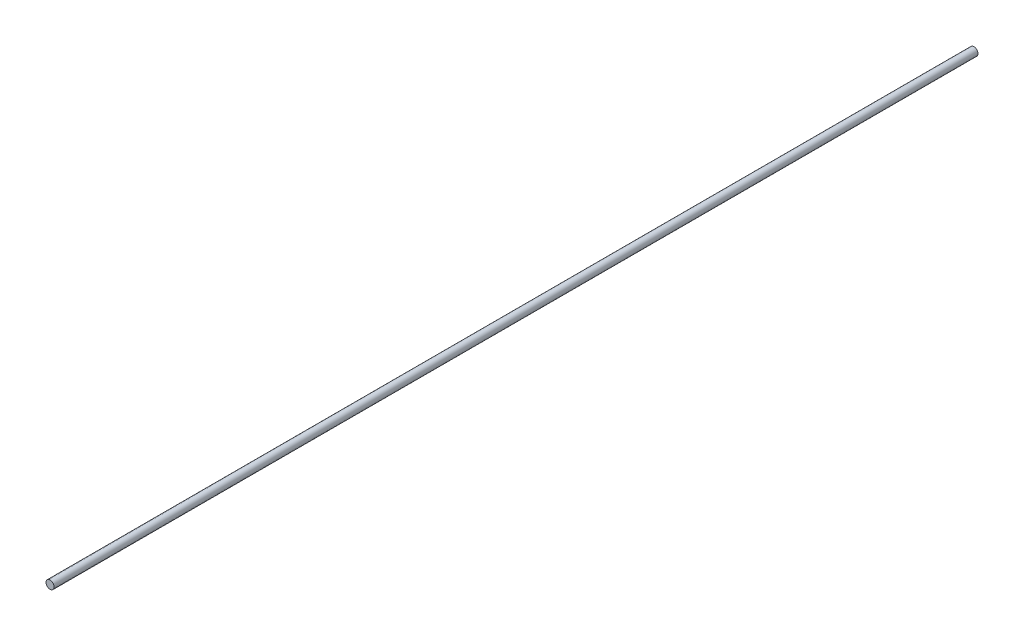
ISO-10303-21;
HEADER;
FILE_DESCRIPTION(('STEP AP214'),'2;1');
FILE_NAME('part.step','',(''),(''),'','','');
FILE_SCHEMA(('AUTOMOTIVE_DESIGN { 1 0 10303 214 1 1 1 1 }'));
ENDSEC;
DATA;
#1=APPLICATION_CONTEXT('core data for automotive mechanical design processes');
#2=APPLICATION_PROTOCOL_DEFINITION('international standard','automotive_design',2000,#1);
#3=PRODUCT_CONTEXT('',#1,'mechanical');
#4=PRODUCT('Part','Part','',(#3));
#5=PRODUCT_RELATED_PRODUCT_CATEGORY('part','',(#4));
#6=PRODUCT_DEFINITION_FORMATION('','',#4);
#7=PRODUCT_DEFINITION_CONTEXT('part definition',#1,'design');
#8=PRODUCT_DEFINITION('design','',#6,#7);
#9=PRODUCT_DEFINITION_SHAPE('','',#8);
#10=(LENGTH_UNIT() NAMED_UNIT(*) SI_UNIT(.MILLI.,.METRE.));
#11=(NAMED_UNIT(*) PLANE_ANGLE_UNIT() SI_UNIT($,.RADIAN.));
#12=(NAMED_UNIT(*) SI_UNIT($,.STERADIAN.) SOLID_ANGLE_UNIT());
#13=UNCERTAINTY_MEASURE_WITH_UNIT(LENGTH_MEASURE(1.E-05),#10,'distance_accuracy_value','');
#14=(GEOMETRIC_REPRESENTATION_CONTEXT(3) GLOBAL_UNCERTAINTY_ASSIGNED_CONTEXT((#13)) GLOBAL_UNIT_ASSIGNED_CONTEXT((#10,
#11,#12)) REPRESENTATION_CONTEXT('',''));
#15=CARTESIAN_POINT('',(0.,0.,0.));
#16=DIRECTION('',(0.,0.,1.));
#17=DIRECTION('',(1.,0.,0.));
#18=AXIS2_PLACEMENT_3D('',#15,#16,#17);
#19=CARTESIAN_POINT('',(0.,0.,200.));
#20=DIRECTION('',(0.,0.,-1.));
#21=DIRECTION('',(-1.,0.,0.));
#22=AXIS2_PLACEMENT_3D('',#19,#20,#21);
#23=CYLINDRICAL_SURFACE('',#22,0.875);
#24=CARTESIAN_POINT('',(0.,0.,200.));
#25=DIRECTION('',(0.,0.,1.));
#26=DIRECTION('',(1.,0.,0.));
#27=AXIS2_PLACEMENT_3D('',#24,#25,#26);
#28=CIRCLE('',#27,0.875);
#29=CARTESIAN_POINT('',(0.875,0.,200.));
#30=VERTEX_POINT('',#29);
#31=EDGE_CURVE('E10',#30,#30,#28,.T.);
#32=ORIENTED_EDGE('',*,*,#31,.F.);
#33=EDGE_LOOP('',(#32));
#34=FACE_BOUND('',#33,.T.);
#35=CARTESIAN_POINT('',(0.,0.,0.));
#36=DIRECTION('',(0.,0.,1.));
#37=DIRECTION('',(1.,0.,0.));
#38=AXIS2_PLACEMENT_3D('',#35,#36,#37);
#39=CIRCLE('',#38,0.875);
#40=CARTESIAN_POINT('',(0.875,0.,0.));
#41=VERTEX_POINT('',#40);
#42=EDGE_CURVE('E18',#41,#41,#39,.T.);
#43=ORIENTED_EDGE('',*,*,#42,.T.);
#44=EDGE_LOOP('',(#43));
#45=FACE_BOUND('',#44,.T.);
#46=ADVANCED_FACE('F15',(#34,#45),#23,.T.);
#47=CARTESIAN_POINT('',(0.,0.,200.));
#48=DIRECTION('',(0.,0.,1.));
#49=DIRECTION('',(1.,0.,0.));
#50=AXIS2_PLACEMENT_3D('',#47,#48,#49);
#51=PLANE('',#50);
#52=ORIENTED_EDGE('',*,*,#31,.T.);
#53=EDGE_LOOP('',(#52));
#54=FACE_BOUND('',#53,.T.);
#55=ADVANCED_FACE('F28',(#54),#51,.T.);
#56=CARTESIAN_POINT('',(0.,0.,0.));
#57=DIRECTION('',(0.,0.,1.));
#58=DIRECTION('',(1.,0.,0.));
#59=AXIS2_PLACEMENT_3D('',#56,#57,#58);
#60=PLANE('',#59);
#61=ORIENTED_EDGE('',*,*,#42,.F.);
#62=EDGE_LOOP('',(#61));
#63=FACE_BOUND('',#62,.T.);
#64=ADVANCED_FACE('F29',(#63),#60,.F.);
#65=CLOSED_SHELL('',(#46,#55,#64));
#66=MANIFOLD_SOLID_BREP('B1',#65);
#67=ADVANCED_BREP_SHAPE_REPRESENTATION('',(#18,#66),#14);
#68=SHAPE_DEFINITION_REPRESENTATION(#9,#67);
ENDSEC;
END-ISO-10303-21;
